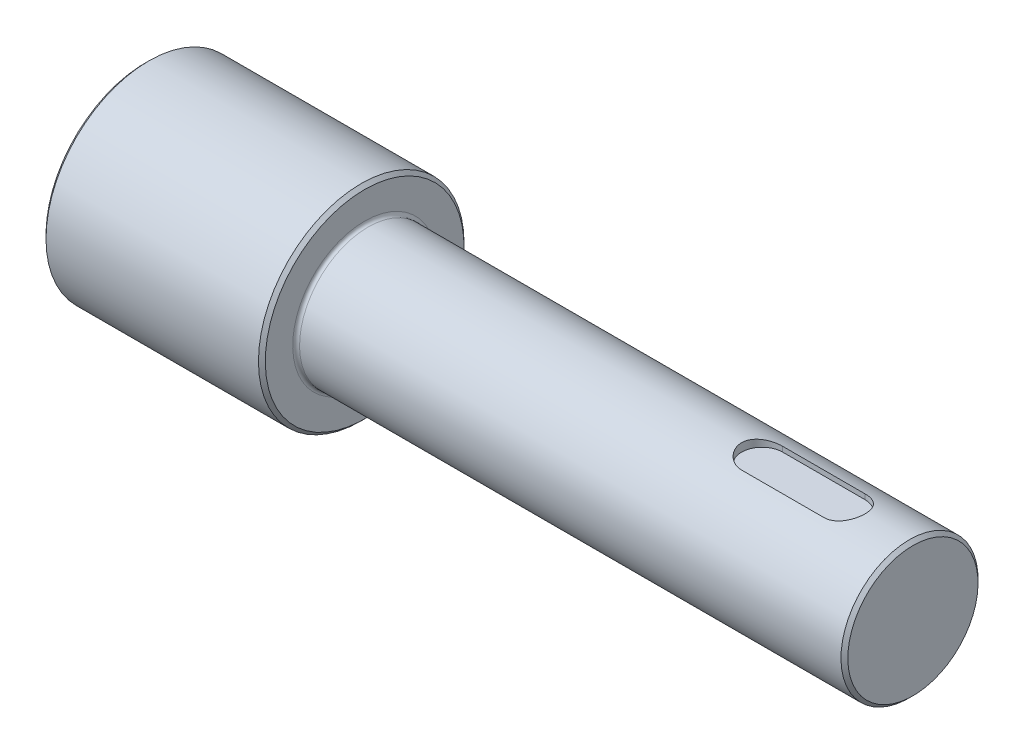
ISO-10303-21;
HEADER;
FILE_DESCRIPTION(('STEP AP214'),'2;1');
FILE_NAME('part.step','',(''),(''),'','','');
FILE_SCHEMA(('AUTOMOTIVE_DESIGN { 1 0 10303 214 1 1 1 1 }'));
ENDSEC;
DATA;
#1=APPLICATION_CONTEXT('core data for automotive mechanical design processes');
#2=APPLICATION_PROTOCOL_DEFINITION('international standard','automotive_design',2000,#1);
#3=PRODUCT_CONTEXT('',#1,'mechanical');
#4=PRODUCT('Part','Part','',(#3));
#5=PRODUCT_RELATED_PRODUCT_CATEGORY('part','',(#4));
#6=PRODUCT_DEFINITION_FORMATION('','',#4);
#7=PRODUCT_DEFINITION_CONTEXT('part definition',#1,'design');
#8=PRODUCT_DEFINITION('design','',#6,#7);
#9=PRODUCT_DEFINITION_SHAPE('','',#8);
#10=(LENGTH_UNIT() NAMED_UNIT(*) SI_UNIT(.MILLI.,.METRE.));
#11=(NAMED_UNIT(*) PLANE_ANGLE_UNIT() SI_UNIT($,.RADIAN.));
#12=(NAMED_UNIT(*) SI_UNIT($,.STERADIAN.) SOLID_ANGLE_UNIT());
#13=UNCERTAINTY_MEASURE_WITH_UNIT(LENGTH_MEASURE(1.E-05),#10,'distance_accuracy_value','');
#14=(GEOMETRIC_REPRESENTATION_CONTEXT(3) GLOBAL_UNCERTAINTY_ASSIGNED_CONTEXT((#13)) GLOBAL_UNIT_ASSIGNED_CONTEXT((#10,
#11,#12)) REPRESENTATION_CONTEXT('',''));
#15=CARTESIAN_POINT('',(0.,0.,0.));
#16=DIRECTION('',(0.,0.,1.));
#17=DIRECTION('',(1.,0.,0.));
#18=AXIS2_PLACEMENT_3D('',#15,#16,#17);
#19=CARTESIAN_POINT('',(0.,0.,0.));
#20=DIRECTION('',(-1.,0.,0.));
#21=DIRECTION('',(0.,-1.,0.));
#22=AXIS2_PLACEMENT_3D('',#19,#20,#21);
#23=PLANE('',#22);
#24=CARTESIAN_POINT('',(0.,0.,0.));
#25=DIRECTION('',(-1.,0.,0.));
#26=DIRECTION('',(0.,-1.,0.));
#27=AXIS2_PLACEMENT_3D('',#24,#25,#26);
#28=CIRCLE('',#27,14.5);
#29=CARTESIAN_POINT('',(0.,-14.5,0.));
#30=VERTEX_POINT('',#29);
#31=EDGE_CURVE('E137',#30,#30,#28,.T.);
#32=ORIENTED_EDGE('',*,*,#31,.T.);
#33=EDGE_LOOP('',(#32));
#34=FACE_BOUND('',#33,.T.);
#35=ADVANCED_FACE('F39',(#34),#23,.T.);
#36=CARTESIAN_POINT('',(112.,0.,0.));
#37=DIRECTION('',(1.,0.,0.));
#38=DIRECTION('',(0.,1.,0.));
#39=AXIS2_PLACEMENT_3D('',#36,#37,#38);
#40=CYLINDRICAL_SURFACE('',#39,15.);
#41=CARTESIAN_POINT('',(31.5,0.,0.));
#42=DIRECTION('',(1.,0.,0.));
#43=DIRECTION('',(0.,1.,0.));
#44=AXIS2_PLACEMENT_3D('',#41,#42,#43);
#45=CIRCLE('',#44,15.);
#46=CARTESIAN_POINT('',(31.5,15.,0.));
#47=VERTEX_POINT('',#46);
#48=EDGE_CURVE('E125',#47,#47,#45,.F.);
#49=ORIENTED_EDGE('',*,*,#48,.T.);
#50=EDGE_LOOP('',(#49));
#51=FACE_BOUND('',#50,.T.);
#52=CARTESIAN_POINT('',(0.500000000000014,0.,0.));
#53=DIRECTION('',(-1.,0.,0.));
#54=DIRECTION('',(0.,-1.,0.));
#55=AXIS2_PLACEMENT_3D('',#52,#53,#54);
#56=CIRCLE('',#55,15.);
#57=CARTESIAN_POINT('',(0.500000000000015,-15.,0.));
#58=VERTEX_POINT('',#57);
#59=EDGE_CURVE('E121',#58,#58,#56,.F.);
#60=ORIENTED_EDGE('',*,*,#59,.T.);
#61=EDGE_LOOP('',(#60));
#62=FACE_BOUND('',#61,.T.);
#63=ADVANCED_FACE('F205',(#51,#62),#40,.T.);
#64=CARTESIAN_POINT('',(32.,10.,0.));
#65=DIRECTION('',(1.,0.,0.));
#66=DIRECTION('',(0.,1.,0.));
#67=AXIS2_PLACEMENT_3D('',#64,#65,#66);
#68=PLANE('',#67);
#69=CARTESIAN_POINT('',(32.,0.,0.));
#70=DIRECTION('',(1.,0.,0.));
#71=DIRECTION('',(0.,1.,0.));
#72=AXIS2_PLACEMENT_3D('',#69,#70,#71);
#73=CIRCLE('',#72,10.5);
#74=CARTESIAN_POINT('',(32.,10.5,0.));
#75=VERTEX_POINT('',#74);
#76=EDGE_CURVE('E145',#75,#75,#73,.F.);
#77=ORIENTED_EDGE('',*,*,#76,.T.);
#78=EDGE_LOOP('',(#77));
#79=FACE_BOUND('',#78,.T.);
#80=CARTESIAN_POINT('',(32.,0.,0.));
#81=DIRECTION('',(1.,0.,0.));
#82=DIRECTION('',(0.,1.,0.));
#83=AXIS2_PLACEMENT_3D('',#80,#81,#82);
#84=CIRCLE('',#83,14.5);
#85=CARTESIAN_POINT('',(32.,14.5,0.));
#86=VERTEX_POINT('',#85);
#87=EDGE_CURVE('E111',#86,#86,#84,.T.);
#88=ORIENTED_EDGE('',*,*,#87,.T.);
#89=EDGE_LOOP('',(#88));
#90=FACE_BOUND('',#89,.T.);
#91=ADVANCED_FACE('F185',(#79,#90),#68,.T.);
#92=CARTESIAN_POINT('',(112.,0.,0.));
#93=DIRECTION('',(1.,0.,0.));
#94=DIRECTION('',(0.,1.,0.));
#95=AXIS2_PLACEMENT_3D('',#92,#93,#94);
#96=CYLINDRICAL_SURFACE('',#95,10.);
#97=CARTESIAN_POINT('',(102.,9.53939201416946,3.));
#98=CARTESIAN_POINT('',(102.082335520823,9.53938054248207,3.00001027845728));
#99=CARTESIAN_POINT('',(102.164664455063,9.54045772064378,2.99661062684472));
#100=CARTESIAN_POINT('',(102.328693952765,9.54470412105986,2.98307142899347));
#101=CARTESIAN_POINT('',(102.410394653324,9.54787287296849,2.97293339805418));
#102=CARTESIAN_POINT('',(102.572384915673,9.55620668351003,2.94603140625045));
#103=CARTESIAN_POINT('',(102.652677524043,9.56136667250114,2.92928426957737));
#104=CARTESIAN_POINT('',(102.811475844134,9.57351626651178,2.88932853030395));
#105=CARTESIAN_POINT('',(102.889981509067,9.58050591937828,2.86611975872641));
#106=CARTESIAN_POINT('',(103.12194938799,9.60391637654137,2.78708584446024));
#107=CARTESIAN_POINT('',(103.272068438833,9.62279007830391,2.72181852542973));
#108=CARTESIAN_POINT('',(103.559226043979,9.66493213967819,2.56815043531276));
#109=CARTESIAN_POINT('',(103.696258470762,9.68820254290641,2.4797388992416));
#110=CARTESIAN_POINT('',(103.957722987948,9.73733650515374,2.27929879634443));
#111=CARTESIAN_POINT('',(104.081684874061,9.76325505469874,2.16666914746584));
#112=CARTESIAN_POINT('',(104.309273614839,9.81429628475077,1.92227736150433));
#113=CARTESIAN_POINT('',(104.412897033861,9.8394188301941,1.79051199848164));
#114=CARTESIAN_POINT('',(104.598926865095,9.88666477976534,1.50821997465697));
#115=CARTESIAN_POINT('',(104.680850179783,9.90871541546878,1.35736167401016));
#116=CARTESIAN_POINT('',(104.817977004003,9.94668940088144,1.04324233568302));
#117=CARTESIAN_POINT('',(104.873187403368,9.96261433032403,0.87998450868798));
#118=CARTESIAN_POINT('',(104.953759551791,9.98615279768398,0.550649404820597));
#119=CARTESIAN_POINT('',(104.979929703518,9.99399098526792,0.3847862530162));
#120=CARTESIAN_POINT('',(105.004234695146,10.0012640407204,0.0508471415689256));
#121=CARTESIAN_POINT('',(105.002374842678,10.0007004995012,-0.117228393125341));
#122=CARTESIAN_POINT('',(104.971214179309,9.99139205125586,-0.445143199271825));
#123=CARTESIAN_POINT('',(104.942789309192,9.98290831016512,-0.605074290763028));
#124=CARTESIAN_POINT('',(104.860736730375,9.95903027401823,-0.917780104370313));
#125=CARTESIAN_POINT('',(104.807107701317,9.94363561692558,-1.07055445110879));
#126=CARTESIAN_POINT('',(104.675575556475,9.90730429851782,-1.36669563173912));
#127=CARTESIAN_POINT('',(104.597396711224,9.88630511384915,-1.50993201207613));
#128=CARTESIAN_POINT('',(104.419202819966,9.84099249303647,-1.78153105916101));
#129=CARTESIAN_POINT('',(104.319182881059,9.81667831471806,-1.90989038323251));
#130=CARTESIAN_POINT('',(104.095616023815,9.7662334714278,-2.15330901082205));
#131=CARTESIAN_POINT('',(103.971312272474,9.74006890899097,-2.26766702955975));
#132=CARTESIAN_POINT('',(103.705005153149,9.68968430229327,-2.47413538985067));
#133=CARTESIAN_POINT('',(103.56299663927,9.66546482675134,-2.5662392402618));
#134=CARTESIAN_POINT('',(103.2634381431,9.62154457591303,-2.72632814481701));
#135=CARTESIAN_POINT('',(103.105745640813,9.60189192491895,-2.79406012682263));
#136=CARTESIAN_POINT('',(102.780550992037,9.56991327306403,-2.90171772009405));
#137=CARTESIAN_POINT('',(102.613064278571,9.5575760695175,-2.94168586436072));
#138=CARTESIAN_POINT('',(102.37001022186,9.54628064650012,-2.97802407180159));
#139=CARTESIAN_POINT('',(102.296218531641,9.54370312550533,-2.98626405978017));
#140=CARTESIAN_POINT('',(102.148297041801,9.54025857223564,-2.99724711229709));
#141=CARTESIAN_POINT('',(102.074167900672,9.53938902493288,-2.99999825936538));
#142=CARTESIAN_POINT('',(102.,9.53939201416946,-3.));
#143=B_SPLINE_CURVE_WITH_KNOTS('',3,(#97,#98,#99,#100,#101,#102,#103,#104,#105,#106,#107,#108,
#109,#110,#111,#112,#113,#114,#115,#116,#117,#118,#119,#120,#121,#122,#123,#124,#125,#126,#127,
#128,#129,#130,#131,#132,#133,#134,#135,#136,#137,#138,#139,#140,#141,#142),.UNSPECIFIED.,.F.,
.F.,(4,2,2,2,2,2,2,2,2,2,2,2,2,2,2,2,2,2,2,2,2,2,4),(0.,0.246918142439474,0.493780777706094,
0.740019009623013,0.986263681482027,1.47813347402025,1.97023245590778,2.47635119822767,
2.98255536239033,3.49922810620071,4.01576751791673,4.51753600864764,5.01920948804101,
5.50490358251093,5.99062312360832,6.48200583350622,6.9734987373917,7.48389234847123,
7.99443465298716,8.51013494368214,9.02504345105574,9.24774267716778,9.47011372732391),.UNSPECIFIED.);
#144=CARTESIAN_POINT('',(102.,9.53939201416946,3.));
#145=VERTEX_POINT('',#144);
#146=CARTESIAN_POINT('',(102.,9.53939201416946,-3.));
#147=VERTEX_POINT('',#146);
#148=EDGE_CURVE('E149',#145,#147,#143,.T.);
#149=ORIENTED_EDGE('',*,*,#148,.F.);
#150=DIRECTION('',(1.,0.,0.));
#151=VECTOR('',#150,1.);
#152=CARTESIAN_POINT('',(112.,9.53939201416946,3.));
#153=LINE('',#152,#151);
#154=CARTESIAN_POINT('',(90.,9.53939201416946,3.));
#155=VERTEX_POINT('',#154);
#156=EDGE_CURVE('E11',#155,#145,#153,.T.);
#157=ORIENTED_EDGE('',*,*,#156,.F.);
#158=CARTESIAN_POINT('',(90.,9.53939201416946,-3.));
#159=CARTESIAN_POINT('',(89.9176644791773,9.53938054248207,-3.00001027845728));
#160=CARTESIAN_POINT('',(89.8353355449368,9.54045772064379,-2.99661062684472));
#161=CARTESIAN_POINT('',(89.6713060472345,9.54470412105986,-2.98307142899347));
#162=CARTESIAN_POINT('',(89.5896053466756,9.54787287296849,-2.97293339805418));
#163=CARTESIAN_POINT('',(89.4276150843268,9.55620668351003,-2.94603140625045));
#164=CARTESIAN_POINT('',(89.347322475957,9.56136667250114,-2.92928426957737));
#165=CARTESIAN_POINT('',(89.1885241558658,9.57351626651178,-2.88932853030394));
#166=CARTESIAN_POINT('',(89.1100184909326,9.58050591937828,-2.8661197587264));
#167=CARTESIAN_POINT('',(88.8780506120099,9.60391637654137,-2.78708584446024));
#168=CARTESIAN_POINT('',(88.727931561167,9.62279007830391,-2.72181852542972));
#169=CARTESIAN_POINT('',(88.440773956021,9.66493213967819,-2.56815043531276));
#170=CARTESIAN_POINT('',(88.3037415292378,9.68820254290641,-2.4797388992416));
#171=CARTESIAN_POINT('',(88.0422770120522,9.73733650515374,-2.27929879634443));
#172=CARTESIAN_POINT('',(87.9183151259391,9.76325505469874,-2.16666914746585));
#173=CARTESIAN_POINT('',(87.6907263851613,9.81429628475077,-1.92227736150434));
#174=CARTESIAN_POINT('',(87.587102966139,9.8394188301941,-1.79051199848164));
#175=CARTESIAN_POINT('',(87.4010731349055,9.88666477976534,-1.50821997465697));
#176=CARTESIAN_POINT('',(87.3191498202174,9.90871541546877,-1.35736167401016));
#177=CARTESIAN_POINT('',(87.1820229959971,9.94668940088144,-1.04324233568303));
#178=CARTESIAN_POINT('',(87.1268125966321,9.96261433032403,-0.879984508687982));
#179=CARTESIAN_POINT('',(87.046240448209,9.98615279768398,-0.550649404820598));
#180=CARTESIAN_POINT('',(87.0200702964824,9.99399098526792,-0.3847862530162));
#181=CARTESIAN_POINT('',(86.995765304854,10.0012640407204,-0.0508471415689261));
#182=CARTESIAN_POINT('',(86.9976251573218,10.0007004995012,0.11722839312534));
#183=CARTESIAN_POINT('',(87.0287858206914,9.99139205125586,0.445143199271824));
#184=CARTESIAN_POINT('',(87.0572106908081,9.98290831016512,0.605074290763028));
#185=CARTESIAN_POINT('',(87.1392632696255,9.95903027401823,0.917780104370313));
#186=CARTESIAN_POINT('',(87.1928922986827,9.94363561692558,1.07055445110879));
#187=CARTESIAN_POINT('',(87.3244244435248,9.90730429851782,1.36669563173912));
#188=CARTESIAN_POINT('',(87.4026032887761,9.88630511384915,1.50993201207613));
#189=CARTESIAN_POINT('',(87.5807971800344,9.84099249303647,1.78153105916101));
#190=CARTESIAN_POINT('',(87.6808171189407,9.81667831471806,1.90989038323251));
#191=CARTESIAN_POINT('',(87.9043839761846,9.7662334714278,2.15330901082205));
#192=CARTESIAN_POINT('',(88.0286877275262,9.74006890899097,2.26766702955975));
#193=CARTESIAN_POINT('',(88.2949948468511,9.68968430229327,2.47413538985067));
#194=CARTESIAN_POINT('',(88.4370033607298,9.66546482675134,2.5662392402618));
#195=CARTESIAN_POINT('',(88.7365618568999,9.62154457591303,2.72632814481701));
#196=CARTESIAN_POINT('',(88.8942543591871,9.60189192491895,2.79406012682263));
#197=CARTESIAN_POINT('',(89.2194490079631,9.56991327306402,2.90171772009405));
#198=CARTESIAN_POINT('',(89.3869357214287,9.5575760695175,2.94168586436072));
#199=CARTESIAN_POINT('',(89.6299897781404,9.54628064650012,2.97802407180159));
#200=CARTESIAN_POINT('',(89.7037814683593,9.54370312550533,2.98626405978017));
#201=CARTESIAN_POINT('',(89.8517029581991,9.54025857223564,2.99724711229709));
#202=CARTESIAN_POINT('',(89.9258320993277,9.53938902493288,2.99999825936538));
#203=CARTESIAN_POINT('',(90.,9.53939201416946,3.));
#204=B_SPLINE_CURVE_WITH_KNOTS('',3,(#158,#159,#160,#161,#162,#163,#164,#165,#166,#167,#168,
#169,#170,#171,#172,#173,#174,#175,#176,#177,#178,#179,#180,#181,#182,#183,#184,#185,#186,#187,
#188,#189,#190,#191,#192,#193,#194,#195,#196,#197,#198,#199,#200,#201,#202,#203),.UNSPECIFIED.,
.F.,.F.,(4,2,2,2,2,2,2,2,2,2,2,2,2,2,2,2,2,2,2,2,2,2,4),(0.,0.246918142439488,0.493780777706108,
0.740019009623027,0.986263681482027,1.47813347402025,1.97023245590778,2.47635119822765,
2.98255536239033,3.4992281062007,4.01576751791672,4.51753600864764,5.01920948804101,
5.50490358251093,5.99062312360832,6.48200583350622,6.9734987373917,7.48389234847122,
7.99443465298715,8.51013494368214,9.02504345105574,9.2477426771678,9.47011372732391),.UNSPECIFIED.);
#205=CARTESIAN_POINT('',(90.,9.53939201416946,-3.));
#206=VERTEX_POINT('',#205);
#207=EDGE_CURVE('E48',#206,#155,#204,.T.);
#208=ORIENTED_EDGE('',*,*,#207,.F.);
#209=DIRECTION('',(1.,0.,0.));
#210=VECTOR('',#209,1.);
#211=CARTESIAN_POINT('',(112.,9.53939201416946,-3.));
#212=LINE('',#211,#210);
#213=EDGE_CURVE('E158',#147,#206,#212,.F.);
#214=ORIENTED_EDGE('',*,*,#213,.F.);
#215=EDGE_LOOP('',(#149,#157,#208,#214));
#216=FACE_BOUND('',#215,.T.);
#217=CARTESIAN_POINT('',(32.5,0.,0.));
#218=DIRECTION('',(1.,0.,0.));
#219=DIRECTION('',(0.,1.,0.));
#220=AXIS2_PLACEMENT_3D('',#217,#218,#219);
#221=CIRCLE('',#220,10.);
#222=CARTESIAN_POINT('',(32.5,10.,0.));
#223=VERTEX_POINT('',#222);
#224=EDGE_CURVE('E141',#223,#223,#221,.T.);
#225=ORIENTED_EDGE('',*,*,#224,.T.);
#226=EDGE_LOOP('',(#225));
#227=FACE_BOUND('',#226,.T.);
#228=CARTESIAN_POINT('',(111.5,0.,0.));
#229=DIRECTION('',(1.,0.,0.));
#230=DIRECTION('',(0.,1.,0.));
#231=AXIS2_PLACEMENT_3D('',#228,#229,#230);
#232=CIRCLE('',#231,10.);
#233=CARTESIAN_POINT('',(111.5,10.,0.));
#234=VERTEX_POINT('',#233);
#235=EDGE_CURVE('E133',#234,#234,#232,.F.);
#236=ORIENTED_EDGE('',*,*,#235,.T.);
#237=EDGE_LOOP('',(#236));
#238=FACE_BOUND('',#237,.T.);
#239=ADVANCED_FACE('F159',(#216,#227,#238),#96,.T.);
#240=CARTESIAN_POINT('',(112.,10.,0.));
#241=DIRECTION('',(1.,0.,0.));
#242=DIRECTION('',(0.,1.,0.));
#243=AXIS2_PLACEMENT_3D('',#240,#241,#242);
#244=PLANE('',#243);
#245=CARTESIAN_POINT('',(112.,0.,0.));
#246=DIRECTION('',(1.,0.,0.));
#247=DIRECTION('',(0.,1.,0.));
#248=AXIS2_PLACEMENT_3D('',#245,#246,#247);
#249=CIRCLE('',#248,9.49999999999997);
#250=CARTESIAN_POINT('',(112.,9.49999999999997,0.));
#251=VERTEX_POINT('',#250);
#252=EDGE_CURVE('E129',#251,#251,#249,.T.);
#253=ORIENTED_EDGE('',*,*,#252,.T.);
#254=EDGE_LOOP('',(#253));
#255=FACE_BOUND('',#254,.T.);
#256=ADVANCED_FACE('F175',(#255),#244,.T.);
#257=CARTESIAN_POINT('',(32.,0.,0.));
#258=DIRECTION('',(-1.,0.,0.));
#259=DIRECTION('',(0.,-1.,0.));
#260=AXIS2_PLACEMENT_3D('',#257,#258,#259);
#261=CONICAL_SURFACE('',#260,14.5,0.78539816339745);
#262=ORIENTED_EDGE('',*,*,#48,.F.);
#263=EDGE_LOOP('',(#262));
#264=FACE_BOUND('',#263,.T.);
#265=ORIENTED_EDGE('',*,*,#87,.F.);
#266=EDGE_LOOP('',(#265));
#267=FACE_BOUND('',#266,.T.);
#268=ADVANCED_FACE('F194',(#264,#267),#261,.T.);
#269=CARTESIAN_POINT('',(112.,0.,0.));
#270=DIRECTION('',(-1.,0.,0.));
#271=DIRECTION('',(0.,-1.,0.));
#272=AXIS2_PLACEMENT_3D('',#269,#270,#271);
#273=CONICAL_SURFACE('',#272,9.49999999999997,0.785398163397452);
#274=ORIENTED_EDGE('',*,*,#235,.F.);
#275=EDGE_LOOP('',(#274));
#276=FACE_BOUND('',#275,.T.);
#277=ORIENTED_EDGE('',*,*,#252,.F.);
#278=EDGE_LOOP('',(#277));
#279=FACE_BOUND('',#278,.T.);
#280=ADVANCED_FACE('F190',(#276,#279),#273,.T.);
#281=CARTESIAN_POINT('',(0.500000000000014,0.,0.));
#282=DIRECTION('',(1.,0.,0.));
#283=DIRECTION('',(0.,1.,0.));
#284=AXIS2_PLACEMENT_3D('',#281,#282,#283);
#285=CONICAL_SURFACE('',#284,15.,0.785398163397447);
#286=ORIENTED_EDGE('',*,*,#31,.F.);
#287=EDGE_LOOP('',(#286));
#288=FACE_BOUND('',#287,.T.);
#289=ORIENTED_EDGE('',*,*,#59,.F.);
#290=EDGE_LOOP('',(#289));
#291=FACE_BOUND('',#290,.T.);
#292=ADVANCED_FACE('F193',(#288,#291),#285,.T.);
#293=CARTESIAN_POINT('',(32.5,0.,0.));
#294=DIRECTION('',(1.,0.,0.));
#295=DIRECTION('',(0.,1.,0.));
#296=AXIS2_PLACEMENT_3D('',#293,#294,#295);
#297=TOROIDAL_SURFACE('',#296,10.5,0.5);
#298=ORIENTED_EDGE('',*,*,#76,.F.);
#299=EDGE_LOOP('',(#298));
#300=FACE_BOUND('',#299,.T.);
#301=ORIENTED_EDGE('',*,*,#224,.F.);
#302=EDGE_LOOP('',(#301));
#303=FACE_BOUND('',#302,.T.);
#304=ADVANCED_FACE('F41',(#300,#303),#297,.F.);
#305=CARTESIAN_POINT('',(90.,8.8,0.));
#306=DIRECTION('',(0.,1.,0.));
#307=DIRECTION('',(-1.,0.,0.));
#308=AXIS2_PLACEMENT_3D('',#305,#306,#307);
#309=CYLINDRICAL_SURFACE('',#308,3.);
#310=DIRECTION('',(0.,1.,0.));
#311=VECTOR('',#310,1.);
#312=CARTESIAN_POINT('',(90.,8.8,-3.));
#313=LINE('',#312,#311);
#314=CARTESIAN_POINT('',(90.,8.8,-3.));
#315=VERTEX_POINT('',#314);
#316=EDGE_CURVE('E108',#315,#206,#313,.T.);
#317=ORIENTED_EDGE('',*,*,#316,.T.);
#318=ORIENTED_EDGE('',*,*,#207,.T.);
#319=DIRECTION('',(0.,1.,0.));
#320=VECTOR('',#319,1.);
#321=CARTESIAN_POINT('',(90.,8.8,3.));
#322=LINE('',#321,#320);
#323=CARTESIAN_POINT('',(90.,8.8,3.));
#324=VERTEX_POINT('',#323);
#325=EDGE_CURVE('E54',#324,#155,#322,.T.);
#326=ORIENTED_EDGE('',*,*,#325,.F.);
#327=CARTESIAN_POINT('',(90.,8.8,0.));
#328=DIRECTION('',(0.,1.,0.));
#329=DIRECTION('',(-1.,0.,0.));
#330=AXIS2_PLACEMENT_3D('',#327,#328,#329);
#331=CIRCLE('',#330,3.);
#332=EDGE_CURVE('E83',#315,#324,#331,.T.);
#333=ORIENTED_EDGE('',*,*,#332,.F.);
#334=EDGE_LOOP('',(#317,#318,#326,#333));
#335=FACE_BOUND('',#334,.T.);
#336=ADVANCED_FACE('F81',(#335),#309,.F.);
#337=CARTESIAN_POINT('',(90.,8.8,-3.));
#338=DIRECTION('',(0.,0.,-1.));
#339=DIRECTION('',(-1.,0.,0.));
#340=AXIS2_PLACEMENT_3D('',#337,#338,#339);
#341=PLANE('',#340);
#342=ORIENTED_EDGE('',*,*,#213,.T.);
#343=ORIENTED_EDGE('',*,*,#316,.F.);
#344=DIRECTION('',(-1.,0.,0.));
#345=VECTOR('',#344,1.);
#346=CARTESIAN_POINT('',(90.,8.8,-3.));
#347=LINE('',#346,#345);
#348=CARTESIAN_POINT('',(102.,8.8,-3.));
#349=VERTEX_POINT('',#348);
#350=EDGE_CURVE('E87',#349,#315,#347,.T.);
#351=ORIENTED_EDGE('',*,*,#350,.F.);
#352=DIRECTION('',(0.,1.,0.));
#353=VECTOR('',#352,1.);
#354=CARTESIAN_POINT('',(102.,8.8,-3.));
#355=LINE('',#354,#353);
#356=EDGE_CURVE('E112',#349,#147,#355,.T.);
#357=ORIENTED_EDGE('',*,*,#356,.T.);
#358=EDGE_LOOP('',(#342,#343,#351,#357));
#359=FACE_BOUND('',#358,.T.);
#360=ADVANCED_FACE('F168',(#359),#341,.F.);
#361=CARTESIAN_POINT('',(102.,8.8,0.));
#362=DIRECTION('',(0.,1.,0.));
#363=DIRECTION('',(-1.,0.,0.));
#364=AXIS2_PLACEMENT_3D('',#361,#362,#363);
#365=CYLINDRICAL_SURFACE('',#364,3.);
#366=DIRECTION('',(0.,1.,0.));
#367=VECTOR('',#366,1.);
#368=CARTESIAN_POINT('',(102.,8.8,3.));
#369=LINE('',#368,#367);
#370=CARTESIAN_POINT('',(102.,8.8,3.));
#371=VERTEX_POINT('',#370);
#372=EDGE_CURVE('E86',#371,#145,#369,.T.);
#373=ORIENTED_EDGE('',*,*,#372,.T.);
#374=ORIENTED_EDGE('',*,*,#148,.T.);
#375=ORIENTED_EDGE('',*,*,#356,.F.);
#376=CARTESIAN_POINT('',(102.,8.8,0.));
#377=DIRECTION('',(0.,1.,0.));
#378=DIRECTION('',(-1.,0.,0.));
#379=AXIS2_PLACEMENT_3D('',#376,#377,#378);
#380=CIRCLE('',#379,3.);
#381=EDGE_CURVE('E97',#371,#349,#380,.T.);
#382=ORIENTED_EDGE('',*,*,#381,.F.);
#383=EDGE_LOOP('',(#373,#374,#375,#382));
#384=FACE_BOUND('',#383,.T.);
#385=ADVANCED_FACE('F163',(#384),#365,.F.);
#386=CARTESIAN_POINT('',(90.,8.8,3.));
#387=DIRECTION('',(0.,0.,1.));
#388=DIRECTION('',(1.,0.,0.));
#389=AXIS2_PLACEMENT_3D('',#386,#387,#388);
#390=PLANE('',#389);
#391=ORIENTED_EDGE('',*,*,#156,.T.);
#392=ORIENTED_EDGE('',*,*,#372,.F.);
#393=DIRECTION('',(1.,0.,0.));
#394=VECTOR('',#393,1.);
#395=CARTESIAN_POINT('',(90.,8.8,3.));
#396=LINE('',#395,#394);
#397=EDGE_CURVE('E90',#324,#371,#396,.T.);
#398=ORIENTED_EDGE('',*,*,#397,.F.);
#399=ORIENTED_EDGE('',*,*,#325,.T.);
#400=EDGE_LOOP('',(#391,#392,#398,#399));
#401=FACE_BOUND('',#400,.T.);
#402=ADVANCED_FACE('F91',(#401),#390,.F.);
#403=CARTESIAN_POINT('',(90.,8.8,0.));
#404=DIRECTION('',(0.,1.,0.));
#405=DIRECTION('',(-1.,0.,0.));
#406=AXIS2_PLACEMENT_3D('',#403,#404,#405);
#407=PLANE('',#406);
#408=ORIENTED_EDGE('',*,*,#332,.T.);
#409=ORIENTED_EDGE('',*,*,#397,.T.);
#410=ORIENTED_EDGE('',*,*,#381,.T.);
#411=ORIENTED_EDGE('',*,*,#350,.T.);
#412=EDGE_LOOP('',(#408,#409,#410,#411));
#413=FACE_BOUND('',#412,.T.);
#414=ADVANCED_FACE('F99',(#413),#407,.T.);
#415=CLOSED_SHELL('',(#35,#63,#91,#239,#256,#268,#280,#292,#304,#336,#360,#385,#402,#414));
#416=MANIFOLD_SOLID_BREP('B2',#415);
#417=ADVANCED_BREP_SHAPE_REPRESENTATION('',(#18,#416),#14);
#418=SHAPE_DEFINITION_REPRESENTATION(#9,#417);
ENDSEC;
END-ISO-10303-21;
